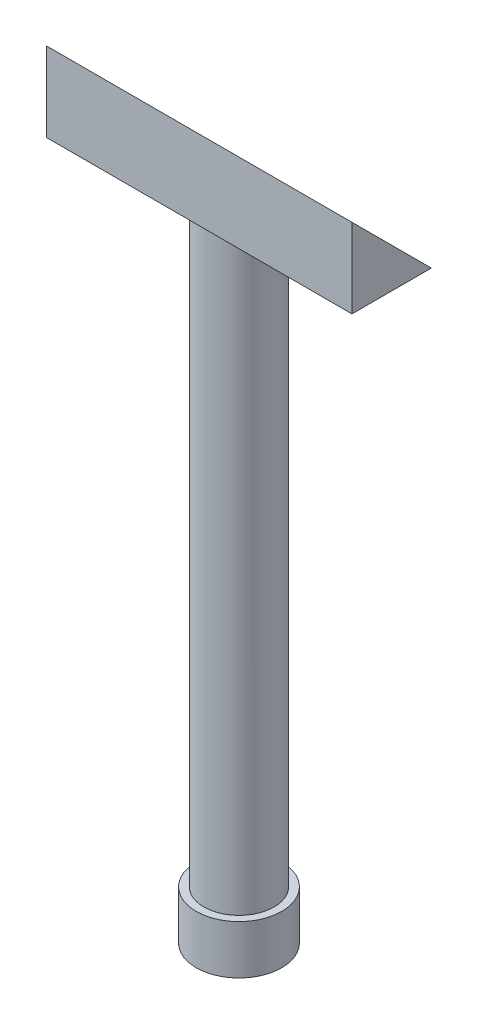
ISO-10303-21;
HEADER;
FILE_DESCRIPTION(('STEP AP214'),'2;1');
FILE_NAME('part.step','',(''),(''),'','','');
FILE_SCHEMA(('AUTOMOTIVE_DESIGN { 1 0 10303 214 1 1 1 1 }'));
ENDSEC;
DATA;
#1=APPLICATION_CONTEXT('core data for automotive mechanical design processes');
#2=APPLICATION_PROTOCOL_DEFINITION('international standard','automotive_design',2000,#1);
#3=PRODUCT_CONTEXT('',#1,'mechanical');
#4=PRODUCT('Part','Part','',(#3));
#5=PRODUCT_RELATED_PRODUCT_CATEGORY('part','',(#4));
#6=PRODUCT_DEFINITION_FORMATION('','',#4);
#7=PRODUCT_DEFINITION_CONTEXT('part definition',#1,'design');
#8=PRODUCT_DEFINITION('design','',#6,#7);
#9=PRODUCT_DEFINITION_SHAPE('','',#8);
#10=(LENGTH_UNIT() NAMED_UNIT(*) SI_UNIT(.MILLI.,.METRE.));
#11=(NAMED_UNIT(*) PLANE_ANGLE_UNIT() SI_UNIT($,.RADIAN.));
#12=(NAMED_UNIT(*) SI_UNIT($,.STERADIAN.) SOLID_ANGLE_UNIT());
#13=UNCERTAINTY_MEASURE_WITH_UNIT(LENGTH_MEASURE(1.E-05),#10,'distance_accuracy_value','');
#14=(GEOMETRIC_REPRESENTATION_CONTEXT(3) GLOBAL_UNCERTAINTY_ASSIGNED_CONTEXT((#13)) GLOBAL_UNIT_ASSIGNED_CONTEXT((#10,
#11,#12)) REPRESENTATION_CONTEXT('',''));
#15=CARTESIAN_POINT('',(0.,0.,0.));
#16=DIRECTION('',(0.,0.,1.));
#17=DIRECTION('',(1.,0.,0.));
#18=AXIS2_PLACEMENT_3D('',#15,#16,#17);
#19=CARTESIAN_POINT('',(0.,105.,0.));
#20=DIRECTION('',(0.,-1.,0.));
#21=DIRECTION('',(0.,0.,-1.));
#22=AXIS2_PLACEMENT_3D('',#19,#20,#21);
#23=CYLINDRICAL_SURFACE('',#22,5.75);
#24=CARTESIAN_POINT('',(0.,7.99999999999999,0.));
#25=DIRECTION('',(0.,1.,0.));
#26=DIRECTION('',(0.,0.,1.));
#27=AXIS2_PLACEMENT_3D('',#24,#25,#26);
#28=CIRCLE('',#27,5.75);
#29=CARTESIAN_POINT('',(0.,7.99999999999999,5.75));
#30=VERTEX_POINT('',#29);
#31=EDGE_CURVE('E110',#30,#30,#28,.T.);
#32=ORIENTED_EDGE('',*,*,#31,.T.);
#33=EDGE_LOOP('',(#32));
#34=FACE_BOUND('',#33,.T.);
#35=CARTESIAN_POINT('',(0.,105.,0.));
#36=DIRECTION('',(0.,-1.,0.));
#37=DIRECTION('',(0.,0.,-1.));
#38=AXIS2_PLACEMENT_3D('',#35,#36,#37);
#39=CIRCLE('',#38,5.75);
#40=CARTESIAN_POINT('',(0.,105.,-5.75));
#41=VERTEX_POINT('',#40);
#42=EDGE_CURVE('E107',#41,#41,#39,.T.);
#43=ORIENTED_EDGE('',*,*,#42,.T.);
#44=EDGE_LOOP('',(#43));
#45=FACE_BOUND('',#44,.T.);
#46=ADVANCED_FACE('F39',(#34,#45),#23,.T.);
#47=CARTESIAN_POINT('',(0.,105.,0.));
#48=DIRECTION('',(0.,-1.,0.));
#49=DIRECTION('',(0.,0.,-1.));
#50=AXIS2_PLACEMENT_3D('',#47,#48,#49);
#51=CYLINDRICAL_SURFACE('',#50,3.05);
#52=CARTESIAN_POINT('',(0.,105.,0.));
#53=DIRECTION('',(0.,-1.,0.));
#54=DIRECTION('',(0.,0.,-1.));
#55=AXIS2_PLACEMENT_3D('',#52,#53,#54);
#56=CIRCLE('',#55,3.05);
#57=CARTESIAN_POINT('',(0.,105.,-3.05));
#58=VERTEX_POINT('',#57);
#59=EDGE_CURVE('E90',#58,#58,#56,.T.);
#60=ORIENTED_EDGE('',*,*,#59,.F.);
#61=EDGE_LOOP('',(#60));
#62=FACE_BOUND('',#61,.T.);
#63=CARTESIAN_POINT('',(0.,0.,0.));
#64=DIRECTION('',(0.,-1.,0.));
#65=DIRECTION('',(0.,0.,-1.));
#66=AXIS2_PLACEMENT_3D('',#63,#64,#65);
#67=CIRCLE('',#66,3.05);
#68=CARTESIAN_POINT('',(0.,0.,-3.05));
#69=VERTEX_POINT('',#68);
#70=EDGE_CURVE('E103',#69,#69,#67,.T.);
#71=ORIENTED_EDGE('',*,*,#70,.T.);
#72=EDGE_LOOP('',(#71));
#73=FACE_BOUND('',#72,.T.);
#74=ADVANCED_FACE('F127',(#62,#73),#51,.F.);
#75=CARTESIAN_POINT('',(0.,8.,0.));
#76=DIRECTION('',(0.,-1.,0.));
#77=DIRECTION('',(0.,0.,-1.));
#78=AXIS2_PLACEMENT_3D('',#75,#76,#77);
#79=CYLINDRICAL_SURFACE('',#78,7.);
#80=CARTESIAN_POINT('',(0.,8.,0.));
#81=DIRECTION('',(0.,1.,0.));
#82=DIRECTION('',(0.,0.,1.));
#83=AXIS2_PLACEMENT_3D('',#80,#81,#82);
#84=CIRCLE('',#83,7.);
#85=CARTESIAN_POINT('',(0.,8.,7.));
#86=VERTEX_POINT('',#85);
#87=EDGE_CURVE('E96',#86,#86,#84,.T.);
#88=ORIENTED_EDGE('',*,*,#87,.F.);
#89=EDGE_LOOP('',(#88));
#90=FACE_BOUND('',#89,.T.);
#91=CARTESIAN_POINT('',(0.,0.,0.));
#92=DIRECTION('',(0.,1.,0.));
#93=DIRECTION('',(0.,0.,1.));
#94=AXIS2_PLACEMENT_3D('',#91,#92,#93);
#95=CIRCLE('',#94,7.);
#96=CARTESIAN_POINT('',(0.,0.,7.));
#97=VERTEX_POINT('',#96);
#98=EDGE_CURVE('E106',#97,#97,#95,.T.);
#99=ORIENTED_EDGE('',*,*,#98,.T.);
#100=EDGE_LOOP('',(#99));
#101=FACE_BOUND('',#100,.T.);
#102=ADVANCED_FACE('F118',(#90,#101),#79,.T.);
#103=CARTESIAN_POINT('',(0.,8.,0.));
#104=DIRECTION('',(0.,1.,0.));
#105=DIRECTION('',(0.,0.,1.));
#106=AXIS2_PLACEMENT_3D('',#103,#104,#105);
#107=PLANE('',#106);
#108=ORIENTED_EDGE('',*,*,#31,.F.);
#109=EDGE_LOOP('',(#108));
#110=FACE_BOUND('',#109,.T.);
#111=ORIENTED_EDGE('',*,*,#87,.T.);
#112=EDGE_LOOP('',(#111));
#113=FACE_BOUND('',#112,.T.);
#114=ADVANCED_FACE('F123',(#110,#113),#107,.T.);
#115=CARTESIAN_POINT('',(0.,0.,0.));
#116=DIRECTION('',(0.,1.,0.));
#117=DIRECTION('',(0.,0.,1.));
#118=AXIS2_PLACEMENT_3D('',#115,#116,#117);
#119=PLANE('',#118);
#120=ORIENTED_EDGE('',*,*,#98,.F.);
#121=EDGE_LOOP('',(#120));
#122=FACE_BOUND('',#121,.T.);
#123=ORIENTED_EDGE('',*,*,#70,.F.);
#124=EDGE_LOOP('',(#123));
#125=FACE_BOUND('',#124,.T.);
#126=ADVANCED_FACE('F120',(#122,#125),#119,.F.);
#127=CARTESIAN_POINT('',(0.,105.,0.));
#128=DIRECTION('',(0.,1.,0.));
#129=DIRECTION('',(0.,0.,1.));
#130=AXIS2_PLACEMENT_3D('',#127,#128,#129);
#131=PLANE('',#130);
#132=ORIENTED_EDGE('',*,*,#42,.F.);
#133=EDGE_LOOP('',(#132));
#134=FACE_BOUND('',#133,.T.);
#135=DIRECTION('',(0.,0.,-1.));
#136=VECTOR('',#135,1.);
#137=CARTESIAN_POINT('',(25.,105.,-6.5));
#138=LINE('',#137,#136);
#139=CARTESIAN_POINT('',(25.,105.,6.5));
#140=VERTEX_POINT('',#139);
#141=CARTESIAN_POINT('',(25.,105.,-6.5));
#142=VERTEX_POINT('',#141);
#143=EDGE_CURVE('E89',#140,#142,#138,.T.);
#144=ORIENTED_EDGE('',*,*,#143,.F.);
#145=DIRECTION('',(1.,0.,0.));
#146=VECTOR('',#145,1.);
#147=CARTESIAN_POINT('',(-25.,105.,6.5));
#148=LINE('',#147,#146);
#149=CARTESIAN_POINT('',(-25.,105.,6.5));
#150=VERTEX_POINT('',#149);
#151=EDGE_CURVE('E78',#150,#140,#148,.T.);
#152=ORIENTED_EDGE('',*,*,#151,.F.);
#153=DIRECTION('',(0.,0.,1.));
#154=VECTOR('',#153,1.);
#155=CARTESIAN_POINT('',(-25.,105.,-6.5));
#156=LINE('',#155,#154);
#157=CARTESIAN_POINT('',(-25.,105.,-6.5));
#158=VERTEX_POINT('',#157);
#159=EDGE_CURVE('E71',#158,#150,#156,.T.);
#160=ORIENTED_EDGE('',*,*,#159,.F.);
#161=DIRECTION('',(-1.,0.,0.));
#162=VECTOR('',#161,1.);
#163=CARTESIAN_POINT('',(-25.,105.,-6.5));
#164=LINE('',#163,#162);
#165=EDGE_CURVE('E11',#142,#158,#164,.T.);
#166=ORIENTED_EDGE('',*,*,#165,.F.);
#167=EDGE_LOOP('',(#144,#152,#160,#166));
#168=FACE_BOUND('',#167,.T.);
#169=ADVANCED_FACE('F92',(#134,#168),#131,.F.);
#170=CARTESIAN_POINT('',(-25.,109.,6.5));
#171=DIRECTION('',(0.,0.,-1.));
#172=DIRECTION('',(-1.,0.,0.));
#173=AXIS2_PLACEMENT_3D('',#170,#171,#172);
#174=PLANE('',#173);
#175=DIRECTION('',(0.,-1.,0.));
#176=VECTOR('',#175,1.);
#177=CARTESIAN_POINT('',(25.,109.,6.5));
#178=LINE('',#177,#176);
#179=CARTESIAN_POINT('',(25.,118.,6.5));
#180=VERTEX_POINT('',#179);
#181=EDGE_CURVE('E81',#180,#140,#178,.T.);
#182=ORIENTED_EDGE('',*,*,#181,.F.);
#183=DIRECTION('',(-1.,0.,0.));
#184=VECTOR('',#183,1.);
#185=CARTESIAN_POINT('',(25.,118.,6.5));
#186=LINE('',#185,#184);
#187=CARTESIAN_POINT('',(-25.,118.,6.5));
#188=VERTEX_POINT('',#187);
#189=EDGE_CURVE('E63',#180,#188,#186,.T.);
#190=ORIENTED_EDGE('',*,*,#189,.T.);
#191=DIRECTION('',(0.,-1.,0.));
#192=VECTOR('',#191,1.);
#193=CARTESIAN_POINT('',(-25.,109.,6.5));
#194=LINE('',#193,#192);
#195=EDGE_CURVE('E82',#188,#150,#194,.T.);
#196=ORIENTED_EDGE('',*,*,#195,.T.);
#197=ORIENTED_EDGE('',*,*,#151,.T.);
#198=EDGE_LOOP('',(#182,#190,#196,#197));
#199=FACE_BOUND('',#198,.T.);
#200=ADVANCED_FACE('F80',(#199),#174,.F.);
#201=CARTESIAN_POINT('',(-25.,109.,-6.5));
#202=DIRECTION('',(1.,0.,0.));
#203=DIRECTION('',(0.,0.,-1.));
#204=AXIS2_PLACEMENT_3D('',#201,#202,#203);
#205=PLANE('',#204);
#206=ORIENTED_EDGE('',*,*,#195,.F.);
#207=DIRECTION('',(0.,0.707106781186547,0.707106781186548));
#208=VECTOR('',#207,1.);
#209=CARTESIAN_POINT('',(-25.,105.,-6.5));
#210=LINE('',#209,#208);
#211=EDGE_CURVE('E49',#158,#188,#210,.T.);
#212=ORIENTED_EDGE('',*,*,#211,.F.);
#213=ORIENTED_EDGE('',*,*,#159,.T.);
#214=EDGE_LOOP('',(#206,#212,#213));
#215=FACE_BOUND('',#214,.T.);
#216=ADVANCED_FACE('F41',(#215),#205,.F.);
#217=CARTESIAN_POINT('',(25.,109.,-6.5));
#218=DIRECTION('',(-1.,0.,0.));
#219=DIRECTION('',(0.,0.,1.));
#220=AXIS2_PLACEMENT_3D('',#217,#218,#219);
#221=PLANE('',#220);
#222=ORIENTED_EDGE('',*,*,#143,.T.);
#223=DIRECTION('',(0.,0.707106781186547,0.707106781186548));
#224=VECTOR('',#223,1.);
#225=CARTESIAN_POINT('',(25.,105.,-6.5));
#226=LINE('',#225,#224);
#227=EDGE_CURVE('E43',#142,#180,#226,.T.);
#228=ORIENTED_EDGE('',*,*,#227,.T.);
#229=ORIENTED_EDGE('',*,*,#181,.T.);
#230=EDGE_LOOP('',(#222,#228,#229));
#231=FACE_BOUND('',#230,.T.);
#232=ADVANCED_FACE('F88',(#231),#221,.F.);
#233=ORIENTED_EDGE('',*,*,#59,.T.);
#234=EDGE_LOOP('',(#233));
#235=FACE_BOUND('',#234,.T.);
#236=ADVANCED_FACE('F146',(#235),#131,.F.);
#237=CARTESIAN_POINT('',(25.,105.,-6.5));
#238=DIRECTION('',(0.,-0.707106781186548,0.707106781186547));
#239=DIRECTION('',(0.,-0.707106781186547,-0.707106781186548));
#240=AXIS2_PLACEMENT_3D('',#237,#238,#239);
#241=PLANE('',#240);
#242=ORIENTED_EDGE('',*,*,#211,.T.);
#243=ORIENTED_EDGE('',*,*,#189,.F.);
#244=ORIENTED_EDGE('',*,*,#227,.F.);
#245=ORIENTED_EDGE('',*,*,#165,.T.);
#246=EDGE_LOOP('',(#242,#243,#244,#245));
#247=FACE_BOUND('',#246,.T.);
#248=ADVANCED_FACE('F147',(#247),#241,.F.);
#249=CLOSED_SHELL('',(#46,#74,#102,#114,#126,#169,#200,#216,#232,#236,#248));
#250=MANIFOLD_SOLID_BREP('B2',#249);
#251=ADVANCED_BREP_SHAPE_REPRESENTATION('',(#18,#250),#14);
#252=SHAPE_DEFINITION_REPRESENTATION(#9,#251);
ENDSEC;
END-ISO-10303-21;
